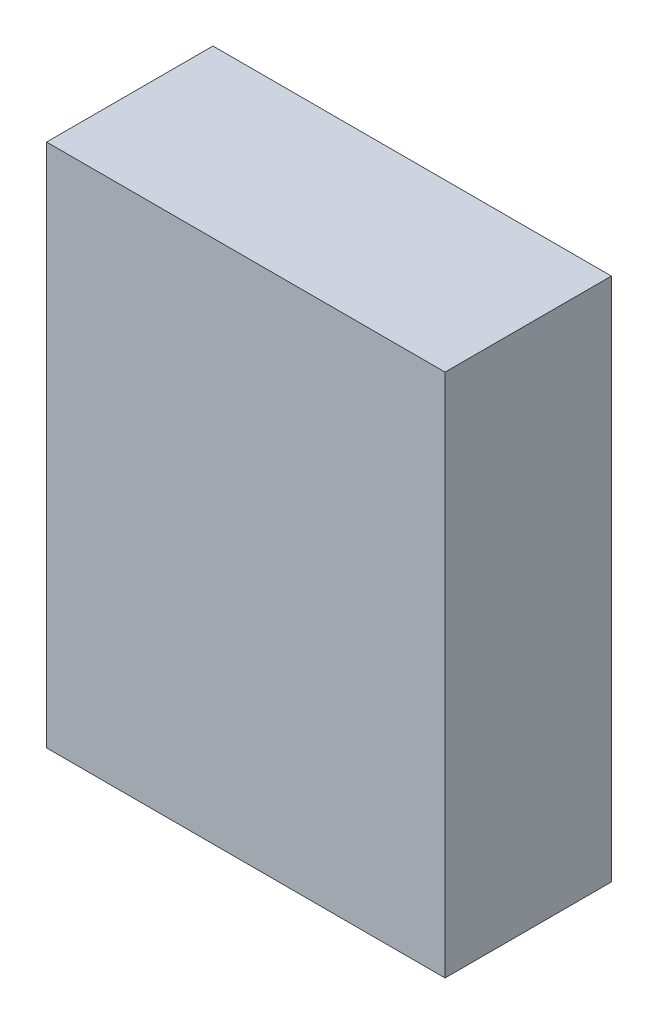
ISO-10303-21;
HEADER;
FILE_DESCRIPTION(('STEP AP214'),'2;1');
FILE_NAME('part.step','',(''),(''),'','','');
FILE_SCHEMA(('AUTOMOTIVE_DESIGN { 1 0 10303 214 1 1 1 1 }'));
ENDSEC;
DATA;
#1=APPLICATION_CONTEXT('core data for automotive mechanical design processes');
#2=APPLICATION_PROTOCOL_DEFINITION('international standard','automotive_design',2000,#1);
#3=PRODUCT_CONTEXT('',#1,'mechanical');
#4=PRODUCT('Part','Part','',(#3));
#5=PRODUCT_RELATED_PRODUCT_CATEGORY('part','',(#4));
#6=PRODUCT_DEFINITION_FORMATION('','',#4);
#7=PRODUCT_DEFINITION_CONTEXT('part definition',#1,'design');
#8=PRODUCT_DEFINITION('design','',#6,#7);
#9=PRODUCT_DEFINITION_SHAPE('','',#8);
#10=(LENGTH_UNIT() NAMED_UNIT(*) SI_UNIT(.MILLI.,.METRE.));
#11=(NAMED_UNIT(*) PLANE_ANGLE_UNIT() SI_UNIT($,.RADIAN.));
#12=(NAMED_UNIT(*) SI_UNIT($,.STERADIAN.) SOLID_ANGLE_UNIT());
#13=UNCERTAINTY_MEASURE_WITH_UNIT(LENGTH_MEASURE(1.E-05),#10,'distance_accuracy_value','');
#14=(GEOMETRIC_REPRESENTATION_CONTEXT(3) GLOBAL_UNCERTAINTY_ASSIGNED_CONTEXT((#13)) GLOBAL_UNIT_ASSIGNED_CONTEXT((#10,
#11,#12)) REPRESENTATION_CONTEXT('',''));
#15=CARTESIAN_POINT('',(0.,0.,0.));
#16=DIRECTION('',(0.,0.,1.));
#17=DIRECTION('',(1.,0.,0.));
#18=AXIS2_PLACEMENT_3D('',#15,#16,#17);
#19=CARTESIAN_POINT('',(26.35,-34.7,22.));
#20=DIRECTION('',(-1.,0.,0.));
#21=DIRECTION('',(0.,0.,1.));
#22=AXIS2_PLACEMENT_3D('',#19,#20,#21);
#23=PLANE('',#22);
#24=DIRECTION('',(0.,1.,0.));
#25=VECTOR('',#24,1.);
#26=CARTESIAN_POINT('',(26.35,-34.7,0.));
#27=LINE('',#26,#25);
#28=CARTESIAN_POINT('',(26.35,-34.7,0.));
#29=VERTEX_POINT('',#28);
#30=CARTESIAN_POINT('',(26.35,34.7,0.));
#31=VERTEX_POINT('',#30);
#32=EDGE_CURVE('E102',#29,#31,#27,.T.);
#33=ORIENTED_EDGE('',*,*,#32,.T.);
#34=DIRECTION('',(0.,0.,-1.));
#35=VECTOR('',#34,1.);
#36=CARTESIAN_POINT('',(26.35,34.7,22.));
#37=LINE('',#36,#35);
#38=CARTESIAN_POINT('',(26.35,34.7,22.));
#39=VERTEX_POINT('',#38);
#40=EDGE_CURVE('E11',#39,#31,#37,.T.);
#41=ORIENTED_EDGE('',*,*,#40,.F.);
#42=DIRECTION('',(0.,1.,0.));
#43=VECTOR('',#42,1.);
#44=CARTESIAN_POINT('',(26.35,-34.7,22.));
#45=LINE('',#44,#43);
#46=CARTESIAN_POINT('',(26.35,-34.7,22.));
#47=VERTEX_POINT('',#46);
#48=EDGE_CURVE('E90',#47,#39,#45,.T.);
#49=ORIENTED_EDGE('',*,*,#48,.F.);
#50=DIRECTION('',(0.,0.,-1.));
#51=VECTOR('',#50,1.);
#52=CARTESIAN_POINT('',(26.35,-34.7,22.));
#53=LINE('',#52,#51);
#54=EDGE_CURVE('E98',#47,#29,#53,.T.);
#55=ORIENTED_EDGE('',*,*,#54,.T.);
#56=EDGE_LOOP('',(#33,#41,#49,#55));
#57=FACE_BOUND('',#56,.T.);
#58=ADVANCED_FACE('F39',(#57),#23,.F.);
#59=CARTESIAN_POINT('',(-26.35,34.7,22.));
#60=DIRECTION('',(0.,-1.,0.));
#61=DIRECTION('',(0.,0.,-1.));
#62=AXIS2_PLACEMENT_3D('',#59,#60,#61);
#63=PLANE('',#62);
#64=DIRECTION('',(-1.,0.,0.));
#65=VECTOR('',#64,1.);
#66=CARTESIAN_POINT('',(-26.35,34.7,0.));
#67=LINE('',#66,#65);
#68=CARTESIAN_POINT('',(-26.35,34.7,0.));
#69=VERTEX_POINT('',#68);
#70=EDGE_CURVE('E94',#31,#69,#67,.T.);
#71=ORIENTED_EDGE('',*,*,#70,.T.);
#72=DIRECTION('',(0.,0.,-1.));
#73=VECTOR('',#72,1.);
#74=CARTESIAN_POINT('',(-26.35,34.7,22.));
#75=LINE('',#74,#73);
#76=CARTESIAN_POINT('',(-26.35,34.7,22.));
#77=VERTEX_POINT('',#76);
#78=EDGE_CURVE('E47',#77,#69,#75,.T.);
#79=ORIENTED_EDGE('',*,*,#78,.F.);
#80=DIRECTION('',(-1.,0.,0.));
#81=VECTOR('',#80,1.);
#82=CARTESIAN_POINT('',(-26.35,34.7,22.));
#83=LINE('',#82,#81);
#84=EDGE_CURVE('E85',#39,#77,#83,.T.);
#85=ORIENTED_EDGE('',*,*,#84,.F.);
#86=ORIENTED_EDGE('',*,*,#40,.T.);
#87=EDGE_LOOP('',(#71,#79,#85,#86));
#88=FACE_BOUND('',#87,.T.);
#89=ADVANCED_FACE('F93',(#88),#63,.F.);
#90=CARTESIAN_POINT('',(-26.35,-34.7,22.));
#91=DIRECTION('',(1.,0.,0.));
#92=DIRECTION('',(0.,0.,-1.));
#93=AXIS2_PLACEMENT_3D('',#90,#91,#92);
#94=PLANE('',#93);
#95=DIRECTION('',(0.,-1.,0.));
#96=VECTOR('',#95,1.);
#97=CARTESIAN_POINT('',(-26.35,-34.7,0.));
#98=LINE('',#97,#96);
#99=CARTESIAN_POINT('',(-26.35,-34.7,0.));
#100=VERTEX_POINT('',#99);
#101=EDGE_CURVE('E72',#69,#100,#98,.T.);
#102=ORIENTED_EDGE('',*,*,#101,.T.);
#103=DIRECTION('',(0.,0.,-1.));
#104=VECTOR('',#103,1.);
#105=CARTESIAN_POINT('',(-26.35,-34.7,22.));
#106=LINE('',#105,#104);
#107=CARTESIAN_POINT('',(-26.35,-34.7,22.));
#108=VERTEX_POINT('',#107);
#109=EDGE_CURVE('E95',#108,#100,#106,.T.);
#110=ORIENTED_EDGE('',*,*,#109,.F.);
#111=DIRECTION('',(0.,-1.,0.));
#112=VECTOR('',#111,1.);
#113=CARTESIAN_POINT('',(-26.35,-34.7,22.));
#114=LINE('',#113,#112);
#115=EDGE_CURVE('E88',#77,#108,#114,.T.);
#116=ORIENTED_EDGE('',*,*,#115,.F.);
#117=ORIENTED_EDGE('',*,*,#78,.T.);
#118=EDGE_LOOP('',(#102,#110,#116,#117));
#119=FACE_BOUND('',#118,.T.);
#120=ADVANCED_FACE('F96',(#119),#94,.F.);
#121=CARTESIAN_POINT('',(-26.35,-34.7,22.));
#122=DIRECTION('',(0.,1.,0.));
#123=DIRECTION('',(0.,0.,1.));
#124=AXIS2_PLACEMENT_3D('',#121,#122,#123);
#125=PLANE('',#124);
#126=DIRECTION('',(1.,0.,0.));
#127=VECTOR('',#126,1.);
#128=CARTESIAN_POINT('',(-26.35,-34.7,0.));
#129=LINE('',#128,#127);
#130=EDGE_CURVE('E78',#100,#29,#129,.T.);
#131=ORIENTED_EDGE('',*,*,#130,.T.);
#132=ORIENTED_EDGE('',*,*,#54,.F.);
#133=DIRECTION('',(1.,0.,0.));
#134=VECTOR('',#133,1.);
#135=CARTESIAN_POINT('',(-26.35,-34.7,22.));
#136=LINE('',#135,#134);
#137=EDGE_CURVE('E55',#108,#47,#136,.T.);
#138=ORIENTED_EDGE('',*,*,#137,.F.);
#139=ORIENTED_EDGE('',*,*,#109,.T.);
#140=EDGE_LOOP('',(#131,#132,#138,#139));
#141=FACE_BOUND('',#140,.T.);
#142=ADVANCED_FACE('F109',(#141),#125,.F.);
#143=CARTESIAN_POINT('',(0.,0.,22.));
#144=DIRECTION('',(0.,0.,-1.));
#145=DIRECTION('',(-1.,0.,0.));
#146=AXIS2_PLACEMENT_3D('',#143,#144,#145);
#147=PLANE('',#146);
#148=ORIENTED_EDGE('',*,*,#48,.T.);
#149=ORIENTED_EDGE('',*,*,#84,.T.);
#150=ORIENTED_EDGE('',*,*,#115,.T.);
#151=ORIENTED_EDGE('',*,*,#137,.T.);
#152=EDGE_LOOP('',(#148,#149,#150,#151));
#153=FACE_BOUND('',#152,.T.);
#154=ADVANCED_FACE('F86',(#153),#147,.F.);
#155=CARTESIAN_POINT('',(0.,0.,0.));
#156=DIRECTION('',(0.,0.,-1.));
#157=DIRECTION('',(-1.,0.,0.));
#158=AXIS2_PLACEMENT_3D('',#155,#156,#157);
#159=PLANE('',#158);
#160=ORIENTED_EDGE('',*,*,#32,.F.);
#161=ORIENTED_EDGE('',*,*,#130,.F.);
#162=ORIENTED_EDGE('',*,*,#101,.F.);
#163=ORIENTED_EDGE('',*,*,#70,.F.);
#164=EDGE_LOOP('',(#160,#161,#162,#163));
#165=FACE_BOUND('',#164,.T.);
#166=ADVANCED_FACE('F112',(#165),#159,.T.);
#167=CLOSED_SHELL('',(#58,#89,#120,#142,#154,#166));
#168=MANIFOLD_SOLID_BREP('B2',#167);
#169=ADVANCED_BREP_SHAPE_REPRESENTATION('',(#18,#168),#14);
#170=SHAPE_DEFINITION_REPRESENTATION(#9,#169);
ENDSEC;
END-ISO-10303-21;
